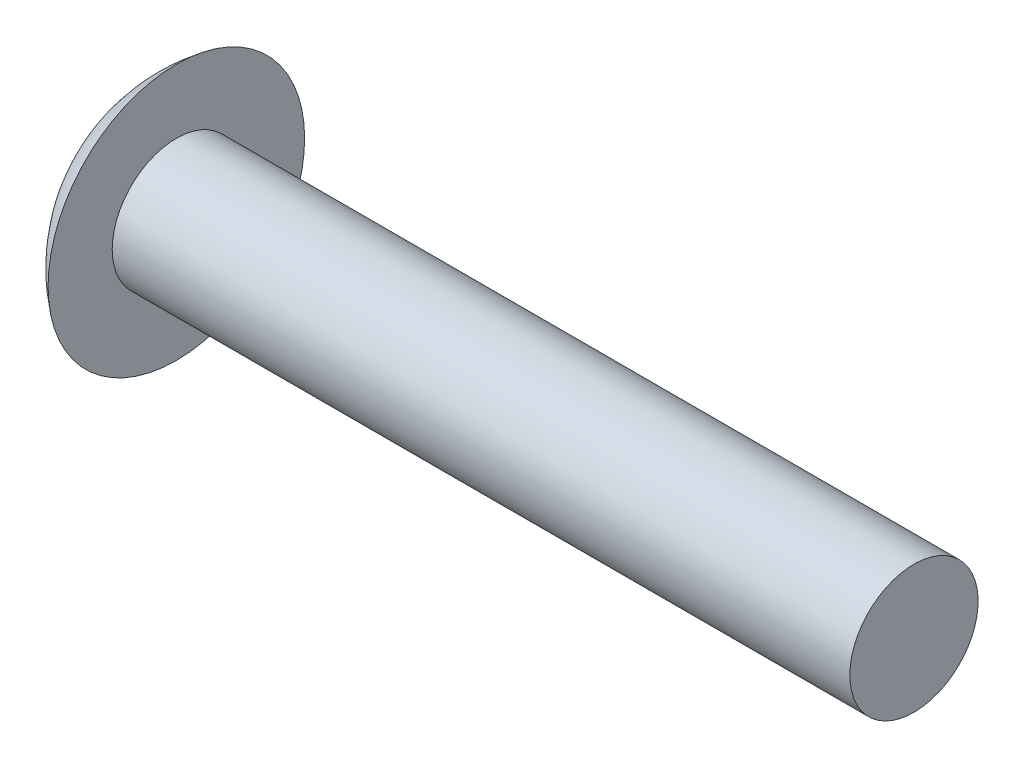
ISO-10303-21;
HEADER;
FILE_DESCRIPTION(('STEP AP214'),'2;1');
FILE_NAME('part.step','',(''),(''),'','','');
FILE_SCHEMA(('AUTOMOTIVE_DESIGN { 1 0 10303 214 1 1 1 1 }'));
ENDSEC;
DATA;
#1=APPLICATION_CONTEXT('core data for automotive mechanical design processes');
#2=APPLICATION_PROTOCOL_DEFINITION('international standard','automotive_design',2000,#1);
#3=PRODUCT_CONTEXT('',#1,'mechanical');
#4=PRODUCT('Part','Part','',(#3));
#5=PRODUCT_RELATED_PRODUCT_CATEGORY('part','',(#4));
#6=PRODUCT_DEFINITION_FORMATION('','',#4);
#7=PRODUCT_DEFINITION_CONTEXT('part definition',#1,'design');
#8=PRODUCT_DEFINITION('design','',#6,#7);
#9=PRODUCT_DEFINITION_SHAPE('','',#8);
#10=(LENGTH_UNIT() NAMED_UNIT(*) SI_UNIT(.MILLI.,.METRE.));
#11=(NAMED_UNIT(*) PLANE_ANGLE_UNIT() SI_UNIT($,.RADIAN.));
#12=(NAMED_UNIT(*) SI_UNIT($,.STERADIAN.) SOLID_ANGLE_UNIT());
#13=UNCERTAINTY_MEASURE_WITH_UNIT(LENGTH_MEASURE(1.E-05),#10,'distance_accuracy_value','');
#14=(GEOMETRIC_REPRESENTATION_CONTEXT(3) GLOBAL_UNCERTAINTY_ASSIGNED_CONTEXT((#13)) GLOBAL_UNIT_ASSIGNED_CONTEXT((#10,
#11,#12)) REPRESENTATION_CONTEXT('',''));
#15=CARTESIAN_POINT('',(0.,0.,0.));
#16=DIRECTION('',(0.,0.,1.));
#17=DIRECTION('',(1.,0.,0.));
#18=AXIS2_PLACEMENT_3D('',#15,#16,#17);
#19=CARTESIAN_POINT('',(5.,0.,0.));
#20=DIRECTION('',(-1.,0.,0.));
#21=DIRECTION('',(0.,1.,0.));
#22=AXIS2_PLACEMENT_3D('',#19,#20,#21);
#23=SPHERICAL_SURFACE('',#22,5.);
#24=CARTESIAN_POINT('',(2.,0.,0.));
#25=DIRECTION('',(-1.,0.,0.));
#26=DIRECTION('',(0.,0.,1.));
#27=AXIS2_PLACEMENT_3D('',#24,#25,#26);
#28=CIRCLE('',#27,4.);
#29=CARTESIAN_POINT('',(2.,0.,4.));
#30=VERTEX_POINT('',#29);
#31=EDGE_CURVE('E10',#30,#30,#28,.T.);
#32=ORIENTED_EDGE('',*,*,#31,.T.);
#33=EDGE_LOOP('',(#32));
#34=FACE_BOUND('',#33,.T.);
#35=ADVANCED_FACE('F31',(#34),#23,.T.);
#36=CARTESIAN_POINT('',(2.,1.99999999999999,0.));
#37=DIRECTION('',(-1.,0.,0.));
#38=DIRECTION('',(0.,0.,1.));
#39=AXIS2_PLACEMENT_3D('',#36,#37,#38);
#40=PLANE('',#39);
#41=ORIENTED_EDGE('',*,*,#31,.F.);
#42=EDGE_LOOP('',(#41));
#43=FACE_BOUND('',#42,.T.);
#44=CARTESIAN_POINT('',(2.,0.,0.));
#45=DIRECTION('',(-1.,0.,0.));
#46=DIRECTION('',(0.,0.,1.));
#47=AXIS2_PLACEMENT_3D('',#44,#45,#46);
#48=CIRCLE('',#47,1.99999999999999);
#49=CARTESIAN_POINT('',(2.,0.,1.99999999999999));
#50=VERTEX_POINT('',#49);
#51=EDGE_CURVE('E37',#50,#50,#48,.T.);
#52=ORIENTED_EDGE('',*,*,#51,.T.);
#53=EDGE_LOOP('',(#52));
#54=FACE_BOUND('',#53,.T.);
#55=ADVANCED_FACE('F56',(#43,#54),#40,.F.);
#56=CARTESIAN_POINT('',(0.,0.,0.));
#57=DIRECTION('',(-1.,0.,0.));
#58=DIRECTION('',(0.,0.,1.));
#59=AXIS2_PLACEMENT_3D('',#56,#57,#58);
#60=CYLINDRICAL_SURFACE('',#59,1.99999999999999);
#61=ORIENTED_EDGE('',*,*,#51,.F.);
#62=EDGE_LOOP('',(#61));
#63=FACE_BOUND('',#62,.T.);
#64=CARTESIAN_POINT('',(25.,0.,0.));
#65=DIRECTION('',(-1.,0.,0.));
#66=DIRECTION('',(0.,0.,1.));
#67=AXIS2_PLACEMENT_3D('',#64,#65,#66);
#68=CIRCLE('',#67,2.);
#69=CARTESIAN_POINT('',(25.,0.,2.));
#70=VERTEX_POINT('',#69);
#71=EDGE_CURVE('E41',#70,#70,#68,.T.);
#72=ORIENTED_EDGE('',*,*,#71,.T.);
#73=EDGE_LOOP('',(#72));
#74=FACE_BOUND('',#73,.T.);
#75=ADVANCED_FACE('F48',(#63,#74),#60,.T.);
#76=CARTESIAN_POINT('',(25.,0.,0.));
#77=DIRECTION('',(-1.,0.,0.));
#78=DIRECTION('',(0.,0.,1.));
#79=AXIS2_PLACEMENT_3D('',#76,#77,#78);
#80=PLANE('',#79);
#81=ORIENTED_EDGE('',*,*,#71,.F.);
#82=EDGE_LOOP('',(#81));
#83=FACE_BOUND('',#82,.T.);
#84=ADVANCED_FACE('F50',(#83),#80,.F.);
#85=CLOSED_SHELL('',(#35,#55,#75,#84));
#86=MANIFOLD_SOLID_BREP('B2',#85);
#87=ADVANCED_BREP_SHAPE_REPRESENTATION('',(#18,#86),#14);
#88=SHAPE_DEFINITION_REPRESENTATION(#9,#87);
ENDSEC;
END-ISO-10303-21;
